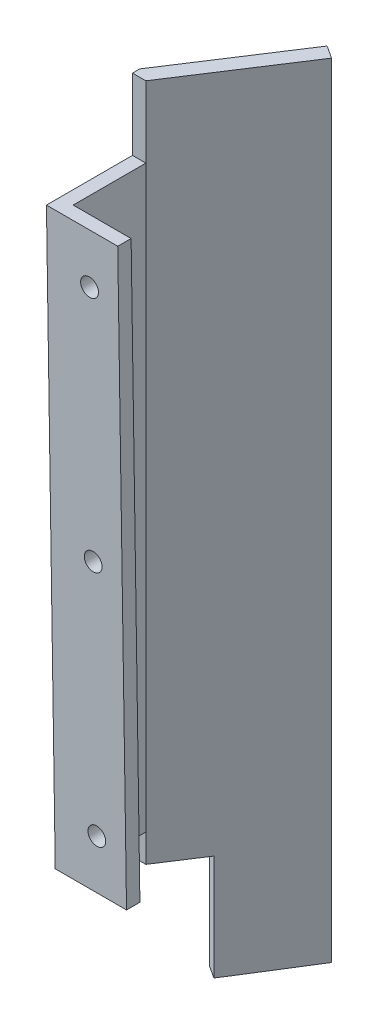
ISO-10303-21;
HEADER;
FILE_DESCRIPTION(('STEP AP214'),'2;1');
FILE_NAME('part.step','',(''),(''),'','','');
FILE_SCHEMA(('AUTOMOTIVE_DESIGN { 1 0 10303 214 1 1 1 1 }'));
ENDSEC;
DATA;
#1=APPLICATION_CONTEXT('core data for automotive mechanical design processes');
#2=APPLICATION_PROTOCOL_DEFINITION('international standard','automotive_design',2000,#1);
#3=PRODUCT_CONTEXT('',#1,'mechanical');
#4=PRODUCT('Part','Part','',(#3));
#5=PRODUCT_RELATED_PRODUCT_CATEGORY('part','',(#4));
#6=PRODUCT_DEFINITION_FORMATION('','',#4);
#7=PRODUCT_DEFINITION_CONTEXT('part definition',#1,'design');
#8=PRODUCT_DEFINITION('design','',#6,#7);
#9=PRODUCT_DEFINITION_SHAPE('','',#8);
#10=(LENGTH_UNIT() NAMED_UNIT(*) SI_UNIT(.MILLI.,.METRE.));
#11=(NAMED_UNIT(*) PLANE_ANGLE_UNIT() SI_UNIT($,.RADIAN.));
#12=(NAMED_UNIT(*) SI_UNIT($,.STERADIAN.) SOLID_ANGLE_UNIT());
#13=UNCERTAINTY_MEASURE_WITH_UNIT(LENGTH_MEASURE(1.E-05),#10,'distance_accuracy_value','');
#14=(GEOMETRIC_REPRESENTATION_CONTEXT(3) GLOBAL_UNCERTAINTY_ASSIGNED_CONTEXT((#13)) GLOBAL_UNIT_ASSIGNED_CONTEXT((#10,
#11,#12)) REPRESENTATION_CONTEXT('',''));
#15=CARTESIAN_POINT('',(0.,0.,0.));
#16=DIRECTION('',(0.,0.,1.));
#17=DIRECTION('',(1.,0.,0.));
#18=AXIS2_PLACEMENT_3D('',#15,#16,#17);
#19=CARTESIAN_POINT('',(0.,0.,0.));
#20=DIRECTION('',(0.,-0.0151837810020936,0.999884719752473));
#21=DIRECTION('',(0.,-0.999884719752473,-0.0151837810020936));
#22=AXIS2_PLACEMENT_3D('',#19,#20,#21);
#23=PLANE('',#22);
#24=CARTESIAN_POINT('',(9.5,41.1951621848328,0.625570436875037));
#25=DIRECTION('',(0.,-0.0151837810020936,0.999884719752473));
#26=DIRECTION('',(0.,-0.999884719752473,-0.0151837810020936));
#27=AXIS2_PLACEMENT_3D('',#24,#25,#26);
#28=CIRCLE('',#27,2.);
#29=CARTESIAN_POINT('',(9.5,39.1953927453278,0.59520287487085));
#30=VERTEX_POINT('',#29);
#31=EDGE_CURVE('E342',#30,#30,#28,.F.);
#32=ORIENTED_EDGE('',*,*,#31,.T.);
#33=EDGE_LOOP('',(#32));
#34=FACE_BOUND('',#33,.T.);
#35=DIRECTION('',(0.,0.999884719752472,0.0151837810020936));
#36=VECTOR('',#35,1.);
#37=CARTESIAN_POINT('',(16.,190.,2.88525100284757));
#38=LINE('',#37,#36);
#39=CARTESIAN_POINT('',(16.,30.,0.455565947818039));
#40=VERTEX_POINT('',#39);
#41=CARTESIAN_POINT('',(16.,160.,2.42968505502953));
#42=VERTEX_POINT('',#41);
#43=EDGE_CURVE('E276',#40,#42,#38,.T.);
#44=ORIENTED_EDGE('',*,*,#43,.T.);
#45=DIRECTION('',(-1.,0.,0.));
#46=VECTOR('',#45,1.);
#47=CARTESIAN_POINT('',(0.,160.,2.42968505502953));
#48=LINE('',#47,#46);
#49=CARTESIAN_POINT('',(0.,160.,2.42968505502953));
#50=VERTEX_POINT('',#49);
#51=EDGE_CURVE('E265',#42,#50,#48,.T.);
#52=ORIENTED_EDGE('',*,*,#51,.T.);
#53=DIRECTION('',(0.,-0.999884719752472,-0.0151837810020936));
#54=VECTOR('',#53,1.);
#55=CARTESIAN_POINT('',(0.,0.,0.));
#56=LINE('',#55,#54);
#57=CARTESIAN_POINT('',(0.,30.,0.455565947818037));
#58=VERTEX_POINT('',#57);
#59=EDGE_CURVE('E176',#50,#58,#56,.T.);
#60=ORIENTED_EDGE('',*,*,#59,.T.);
#61=DIRECTION('',(-1.,0.,0.));
#62=VECTOR('',#61,1.);
#63=CARTESIAN_POINT('',(0.,30.,0.455565947818037));
#64=LINE('',#63,#62);
#65=EDGE_CURVE('E254',#40,#58,#64,.T.);
#66=ORIENTED_EDGE('',*,*,#65,.F.);
#67=EDGE_LOOP('',(#44,#52,#60,#66));
#68=FACE_BOUND('',#67,.T.);
#69=CARTESIAN_POINT('',(9.50000000000001,94.9544486569937,1.44193378006542));
#70=DIRECTION('',(0.,-0.0151837810020936,0.999884719752473));
#71=DIRECTION('',(0.,-0.999884719752473,-0.0151837810020936));
#72=AXIS2_PLACEMENT_3D('',#69,#70,#71);
#73=CIRCLE('',#72,2.);
#74=CARTESIAN_POINT('',(9.50000000000001,92.9546792174888,1.41156621806123));
#75=VERTEX_POINT('',#74);
#76=EDGE_CURVE('E353',#75,#75,#73,.T.);
#77=ORIENTED_EDGE('',*,*,#76,.F.);
#78=EDGE_LOOP('',(#77));
#79=FACE_BOUND('',#78,.T.);
#80=CARTESIAN_POINT('',(9.5,148.713735129155,2.2582971232558));
#81=DIRECTION('',(0.,-0.0151837810020936,0.999884719752473));
#82=DIRECTION('',(0.,-0.999884719752473,-0.0151837810020936));
#83=AXIS2_PLACEMENT_3D('',#80,#81,#82);
#84=CIRCLE('',#83,2.);
#85=CARTESIAN_POINT('',(9.5,146.71396568965,2.22792956125161));
#86=VERTEX_POINT('',#85);
#87=EDGE_CURVE('E357',#86,#86,#84,.T.);
#88=ORIENTED_EDGE('',*,*,#87,.F.);
#89=EDGE_LOOP('',(#88));
#90=FACE_BOUND('',#89,.T.);
#91=ADVANCED_FACE('F43',(#34,#68,#79,#90),#23,.T.);
#92=CARTESIAN_POINT('',(0.,0.0455513430062808,-2.99965415925742));
#93=DIRECTION('',(0.,-0.0151837810020936,0.999884719752473));
#94=DIRECTION('',(0.,-0.999884719752473,-0.0151837810020936));
#95=AXIS2_PLACEMENT_3D('',#92,#93,#94);
#96=PLANE('',#95);
#97=CARTESIAN_POINT('',(9.50000000000001,95.,-1.557720379192));
#98=DIRECTION('',(0.,0.0151837810020936,-0.999884719752473));
#99=DIRECTION('',(0.,0.999884719752473,0.0151837810020936));
#100=AXIS2_PLACEMENT_3D('',#97,#98,#99);
#101=CIRCLE('',#100,2.);
#102=CARTESIAN_POINT('',(9.50000000000001,96.999769439505,-1.52735281718782));
#103=VERTEX_POINT('',#102);
#104=EDGE_CURVE('E343',#103,#103,#101,.T.);
#105=ORIENTED_EDGE('',*,*,#104,.F.);
#106=EDGE_LOOP('',(#105));
#107=FACE_BOUND('',#106,.T.);
#108=CARTESIAN_POINT('',(9.5,41.240713527839,-2.37408372238238));
#109=DIRECTION('',(0.,-0.0151837810020936,0.999884719752473));
#110=DIRECTION('',(0.,-0.999884719752473,-0.0151837810020936));
#111=AXIS2_PLACEMENT_3D('',#108,#109,#110);
#112=CIRCLE('',#111,2.);
#113=CARTESIAN_POINT('',(9.5,39.2409440883341,-2.40445128438657));
#114=VERTEX_POINT('',#113);
#115=EDGE_CURVE('E334',#114,#114,#112,.T.);
#116=ORIENTED_EDGE('',*,*,#115,.T.);
#117=EDGE_LOOP('',(#116));
#118=FACE_BOUND('',#117,.T.);
#119=DIRECTION('',(-1.,0.,0.));
#120=VECTOR('',#119,1.);
#121=CARTESIAN_POINT('',(0.,160.,-0.570660825586255));
#122=LINE('',#121,#120);
#123=CARTESIAN_POINT('',(16.,160.,-0.570660825586253));
#124=VERTEX_POINT('',#123);
#125=CARTESIAN_POINT('',(3.,160.,-0.570660825586254));
#126=VERTEX_POINT('',#125);
#127=EDGE_CURVE('E190',#124,#126,#122,.T.);
#128=ORIENTED_EDGE('',*,*,#127,.F.);
#129=DIRECTION('',(0.,0.999884719752472,0.0151837810020936));
#130=VECTOR('',#129,1.);
#131=CARTESIAN_POINT('',(16.,190.045551343006,-0.114403156409848));
#132=LINE('',#131,#130);
#133=CARTESIAN_POINT('',(16.,30.,-2.54477993279775));
#134=VERTEX_POINT('',#133);
#135=EDGE_CURVE('E281',#134,#124,#132,.T.);
#136=ORIENTED_EDGE('',*,*,#135,.F.);
#137=DIRECTION('',(-1.,0.,0.));
#138=VECTOR('',#137,1.);
#139=CARTESIAN_POINT('',(0.,30.,-2.54477993279775));
#140=LINE('',#139,#138);
#141=CARTESIAN_POINT('',(3.,30.,-2.54477993279775));
#142=VERTEX_POINT('',#141);
#143=EDGE_CURVE('E186',#134,#142,#140,.T.);
#144=ORIENTED_EDGE('',*,*,#143,.T.);
#145=DIRECTION('',(0.,-0.999884719752472,-0.0151837810020936));
#146=VECTOR('',#145,1.);
#147=CARTESIAN_POINT('',(3.,190.045551343006,-0.114403156409849));
#148=LINE('',#147,#146);
#149=EDGE_CURVE('E277',#126,#142,#148,.T.);
#150=ORIENTED_EDGE('',*,*,#149,.F.);
#151=EDGE_LOOP('',(#128,#136,#144,#150));
#152=FACE_BOUND('',#151,.T.);
#153=CARTESIAN_POINT('',(9.5,148.759286472161,-0.741357036001623));
#154=DIRECTION('',(0.,0.0151837810020936,-0.999884719752473));
#155=DIRECTION('',(0.,0.999884719752473,0.0151837810020936));
#156=AXIS2_PLACEMENT_3D('',#153,#154,#155);
#157=CIRCLE('',#156,2.);
#158=CARTESIAN_POINT('',(9.5,150.759055911666,-0.710989473997435));
#159=VERTEX_POINT('',#158);
#160=EDGE_CURVE('E338',#159,#159,#157,.T.);
#161=ORIENTED_EDGE('',*,*,#160,.F.);
#162=EDGE_LOOP('',(#161));
#163=FACE_BOUND('',#162,.T.);
#164=ADVANCED_FACE('F304',(#107,#118,#152,#163),#96,.F.);
#165=CARTESIAN_POINT('',(3.,190.,0.));
#166=DIRECTION('',(-1.,0.,0.));
#167=DIRECTION('',(0.,0.,1.));
#168=AXIS2_PLACEMENT_3D('',#165,#166,#167);
#169=PLANE('',#168);
#170=DIRECTION('',(0.,0.,-1.));
#171=VECTOR('',#170,1.);
#172=CARTESIAN_POINT('',(3.,160.,0.));
#173=LINE('',#172,#171);
#174=CARTESIAN_POINT('',(3.00000000000001,160.,-16.8765178619251));
#175=VERTEX_POINT('',#174);
#176=EDGE_CURVE('E269',#126,#175,#173,.T.);
#177=ORIENTED_EDGE('',*,*,#176,.F.);
#178=ORIENTED_EDGE('',*,*,#149,.T.);
#179=DIRECTION('',(0.,0.,-1.));
#180=VECTOR('',#179,1.);
#181=CARTESIAN_POINT('',(3.,30.,0.));
#182=LINE('',#181,#180);
#183=CARTESIAN_POINT('',(3.,30.,-16.8765178619251));
#184=VERTEX_POINT('',#183);
#185=EDGE_CURVE('E257',#142,#184,#182,.T.);
#186=ORIENTED_EDGE('',*,*,#185,.T.);
#187=DIRECTION('',(0.,-1.,0.));
#188=VECTOR('',#187,1.);
#189=CARTESIAN_POINT('',(3.,190.,-16.8765178619251));
#190=LINE('',#189,#188);
#191=EDGE_CURVE('E182',#175,#184,#190,.T.);
#192=ORIENTED_EDGE('',*,*,#191,.F.);
#193=EDGE_LOOP('',(#177,#178,#186,#192));
#194=FACE_BOUND('',#193,.T.);
#195=ADVANCED_FACE('F45',(#194),#169,.F.);
#196=CARTESIAN_POINT('',(0.,0.,0.));
#197=DIRECTION('',(0.,1.,0.));
#198=DIRECTION('',(0.,0.,1.));
#199=AXIS2_PLACEMENT_3D('',#196,#197,#198);
#200=PLANE('',#199);
#201=DIRECTION('',(-0.83822570686827,0.,-0.545323449289675));
#202=VECTOR('',#201,1.);
#203=CARTESIAN_POINT('',(29.3858124077585,0.,-12.8769403632549));
#204=LINE('',#203,#202);
#205=CARTESIAN_POINT('',(9.01832785776317,0.,-26.1273893021862));
#206=VERTEX_POINT('',#205);
#207=CARTESIAN_POINT('',(6.16836045441106,0.,-27.9814890297711));
#208=VERTEX_POINT('',#207);
#209=EDGE_CURVE('E206',#206,#208,#204,.T.);
#210=ORIENTED_EDGE('',*,*,#209,.T.);
#211=DIRECTION('',(1.,0.,0.));
#212=VECTOR('',#211,1.);
#213=CARTESIAN_POINT('',(0.,0.,-27.9814890297711));
#214=LINE('',#213,#212);
#215=CARTESIAN_POINT('',(10.2245471976015,0.,-27.981489029772));
#216=VERTEX_POINT('',#215);
#217=EDGE_CURVE('E215',#208,#216,#214,.T.);
#218=ORIENTED_EDGE('',*,*,#217,.T.);
#219=DIRECTION('',(0.545323449289675,0.,-0.83822570686827));
#220=VECTOR('',#219,1.);
#221=CARTESIAN_POINT('',(19.4278002617582,0.,-42.1279617612105));
#222=LINE('',#221,#220);
#223=EDGE_CURVE('E169',#206,#216,#222,.T.);
#224=ORIENTED_EDGE('',*,*,#223,.F.);
#225=EDGE_LOOP('',(#210,#218,#224));
#226=FACE_BOUND('',#225,.T.);
#227=ADVANCED_FACE('F214',(#226),#200,.F.);
#228=CARTESIAN_POINT('',(16.,190.045551343006,-0.114403156409848));
#229=DIRECTION('',(1.,0.,0.));
#230=DIRECTION('',(0.,1.,0.));
#231=AXIS2_PLACEMENT_3D('',#228,#229,#230);
#232=PLANE('',#231);
#233=ORIENTED_EDGE('',*,*,#135,.T.);
#234=DIRECTION('',(0.,0.,1.));
#235=VECTOR('',#234,1.);
#236=CARTESIAN_POINT('',(16.,160.,-0.114403156409848));
#237=LINE('',#236,#235);
#238=EDGE_CURVE('E261',#124,#42,#237,.T.);
#239=ORIENTED_EDGE('',*,*,#238,.T.);
#240=ORIENTED_EDGE('',*,*,#43,.F.);
#241=DIRECTION('',(0.,0.,1.));
#242=VECTOR('',#241,1.);
#243=CARTESIAN_POINT('',(16.,30.,-0.114403156409848));
#244=LINE('',#243,#242);
#245=EDGE_CURVE('E241',#134,#40,#244,.T.);
#246=ORIENTED_EDGE('',*,*,#245,.F.);
#247=EDGE_LOOP('',(#233,#239,#240,#246));
#248=FACE_BOUND('',#247,.T.);
#249=ADVANCED_FACE('F301',(#248),#232,.T.);
#250=CARTESIAN_POINT('',(19.4278002617582,190.,-42.1279617612105));
#251=DIRECTION('',(-0.838225706868271,0.,-0.545323449289675));
#252=DIRECTION('',(-0.545323449289675,0.,0.838225706868271));
#253=AXIS2_PLACEMENT_3D('',#250,#251,#252);
#254=PLANE('',#253);
#255=DIRECTION('',(0.,-1.,0.));
#256=VECTOR('',#255,1.);
#257=CARTESIAN_POINT('',(19.4278002617582,190.,-42.1279617612105));
#258=LINE('',#257,#256);
#259=CARTESIAN_POINT('',(19.4278002617582,176.,-42.1279617612105));
#260=VERTEX_POINT('',#259);
#261=CARTESIAN_POINT('',(19.4278002617582,0.214821708605994,-42.1279617612105));
#262=VERTEX_POINT('',#261);
#263=EDGE_CURVE('E173',#260,#262,#258,.T.);
#264=ORIENTED_EDGE('',*,*,#263,.F.);
#265=DIRECTION('',(-0.545323449289675,0.,0.838225706868271));
#266=VECTOR('',#265,1.);
#267=CARTESIAN_POINT('',(19.4278002617582,176.,-42.1279617612105));
#268=LINE('',#267,#266);
#269=CARTESIAN_POINT('',(3.00000000000001,176.,-16.8765178619251));
#270=VERTEX_POINT('',#269);
#271=EDGE_CURVE('E160',#260,#270,#268,.T.);
#272=ORIENTED_EDGE('',*,*,#271,.T.);
#273=EDGE_CURVE('E183',#270,#175,#190,.T.);
#274=ORIENTED_EDGE('',*,*,#273,.T.);
#275=ORIENTED_EDGE('',*,*,#191,.T.);
#276=DIRECTION('',(0.,1.,0.));
#277=VECTOR('',#276,1.);
#278=CARTESIAN_POINT('',(3.,190.,-16.8765178619251));
#279=LINE('',#278,#277);
#280=CARTESIAN_POINT('',(3.,23.695751879168,-16.8765178619251));
#281=VERTEX_POINT('',#280);
#282=EDGE_CURVE('E273',#281,#184,#279,.T.);
#283=ORIENTED_EDGE('',*,*,#282,.F.);
#284=DIRECTION('',(0.545323449289675,0.,-0.838225706868271));
#285=VECTOR('',#284,1.);
#286=CARTESIAN_POINT('',(19.4278002617582,23.6957518791679,-42.1279617612105));
#287=LINE('',#286,#285);
#288=CARTESIAN_POINT('',(9.01832785776318,23.695751879168,-26.1273893021862));
#289=VERTEX_POINT('',#288);
#290=EDGE_CURVE('E66',#281,#289,#287,.T.);
#291=ORIENTED_EDGE('',*,*,#290,.T.);
#292=DIRECTION('',(0.,-1.,0.));
#293=VECTOR('',#292,1.);
#294=CARTESIAN_POINT('',(9.01832785776317,190.,-26.1273893021862));
#295=LINE('',#294,#293);
#296=EDGE_CURVE('E227',#289,#206,#295,.T.);
#297=ORIENTED_EDGE('',*,*,#296,.T.);
#298=ORIENTED_EDGE('',*,*,#223,.T.);
#299=DIRECTION('',(0.545279276649534,0.0127278718797271,-0.838157808371416));
#300=VECTOR('',#299,1.);
#301=CARTESIAN_POINT('',(20.7449558531726,0.245566665055097,-44.1525834386883));
#302=LINE('',#301,#300);
#303=EDGE_CURVE('E329',#216,#262,#302,.T.);
#304=ORIENTED_EDGE('',*,*,#303,.T.);
#305=EDGE_LOOP('',(#264,#272,#274,#275,#283,#291,#297,#298,#304));
#306=FACE_BOUND('',#305,.T.);
#307=ADVANCED_FACE('F317',(#306),#254,.F.);
#308=CARTESIAN_POINT('',(16.5778328584061,190.,-43.9820614887954));
#309=DIRECTION('',(-0.545323449289676,0.,0.83822570686827));
#310=DIRECTION('',(0.83822570686827,0.,0.545323449289676));
#311=AXIS2_PLACEMENT_3D('',#308,#309,#310);
#312=PLANE('',#311);
#313=DIRECTION('',(0.,-1.,0.));
#314=VECTOR('',#313,1.);
#315=CARTESIAN_POINT('',(16.5778328584061,190.,-43.9820614887954));
#316=LINE('',#315,#314);
#317=CARTESIAN_POINT('',(16.5778328584061,176.,-43.9820614887954));
#318=VERTEX_POINT('',#317);
#319=CARTESIAN_POINT('',(16.5778328584061,0.242977198597552,-43.9820614887954));
#320=VERTEX_POINT('',#319);
#321=EDGE_CURVE('E168',#318,#320,#316,.T.);
#322=ORIENTED_EDGE('',*,*,#321,.F.);
#323=DIRECTION('',(0.83822570686827,0.,0.545323449289676));
#324=VECTOR('',#323,1.);
#325=CARTESIAN_POINT('',(16.5778328584061,176.,-43.9820614887954));
#326=LINE('',#325,#324);
#327=EDGE_CURVE('E143',#318,#260,#326,.T.);
#328=ORIENTED_EDGE('',*,*,#327,.T.);
#329=ORIENTED_EDGE('',*,*,#263,.T.);
#330=DIRECTION('',(-0.838196967515067,0.00828074254535564,-0.545304752364623));
#331=VECTOR('',#330,1.);
#332=CARTESIAN_POINT('',(15.2607496120584,0.25598896993112,-44.838914688375));
#333=LINE('',#332,#331);
#334=EDGE_CURVE('E148',#262,#320,#333,.T.);
#335=ORIENTED_EDGE('',*,*,#334,.T.);
#336=EDGE_LOOP('',(#322,#328,#329,#335));
#337=FACE_BOUND('',#336,.T.);
#338=ADVANCED_FACE('F325',(#337),#312,.F.);
#339=CARTESIAN_POINT('',(0.,190.,-18.5));
#340=DIRECTION('',(0.83822570686827,0.,0.545323449289675));
#341=DIRECTION('',(0.545323449289675,0.,-0.83822570686827));
#342=AXIS2_PLACEMENT_3D('',#339,#340,#341);
#343=PLANE('',#342);
#344=DIRECTION('',(0.,-1.,0.));
#345=VECTOR('',#344,1.);
#346=CARTESIAN_POINT('',(0.,190.,-18.5));
#347=LINE('',#346,#345);
#348=CARTESIAN_POINT('',(0.,176.,-18.5));
#349=VERTEX_POINT('',#348);
#350=CARTESIAN_POINT('',(0.,23.695751879168,-18.5));
#351=VERTEX_POINT('',#350);
#352=EDGE_CURVE('E154',#349,#351,#347,.T.);
#353=ORIENTED_EDGE('',*,*,#352,.F.);
#354=DIRECTION('',(0.545323449289675,0.,-0.83822570686827));
#355=VECTOR('',#354,1.);
#356=CARTESIAN_POINT('',(0.,176.,-18.5));
#357=LINE('',#356,#355);
#358=EDGE_CURVE('E140',#349,#318,#357,.T.);
#359=ORIENTED_EDGE('',*,*,#358,.T.);
#360=ORIENTED_EDGE('',*,*,#321,.T.);
#361=DIRECTION('',(-0.545279276649534,-0.0127278718797271,0.838157808371416));
#362=VECTOR('',#361,1.);
#363=CARTESIAN_POINT('',(1.31964577316852,-0.113178369116479,-20.5284493771004));
#364=LINE('',#363,#362);
#365=EDGE_CURVE('E52',#320,#208,#364,.T.);
#366=ORIENTED_EDGE('',*,*,#365,.T.);
#367=DIRECTION('',(0.,-1.,0.));
#368=VECTOR('',#367,1.);
#369=CARTESIAN_POINT('',(6.16836045441106,0.,-27.9814890297711));
#370=LINE('',#369,#368);
#371=CARTESIAN_POINT('',(6.16836045441106,23.695751879168,-27.9814890297711));
#372=VERTEX_POINT('',#371);
#373=EDGE_CURVE('E199',#372,#208,#370,.T.);
#374=ORIENTED_EDGE('',*,*,#373,.F.);
#375=DIRECTION('',(0.545323449289675,0.,-0.83822570686827));
#376=VECTOR('',#375,1.);
#377=CARTESIAN_POINT('',(-0.742100396387685,23.695751879168,-17.3593051882519));
#378=LINE('',#377,#376);
#379=EDGE_CURVE('E166',#351,#372,#378,.T.);
#380=ORIENTED_EDGE('',*,*,#379,.F.);
#381=EDGE_LOOP('',(#353,#359,#360,#366,#374,#380));
#382=FACE_BOUND('',#381,.T.);
#383=ADVANCED_FACE('F163',(#382),#343,.F.);
#384=CARTESIAN_POINT('',(0.,190.,0.));
#385=DIRECTION('',(1.,0.,0.));
#386=DIRECTION('',(0.,0.,-1.));
#387=AXIS2_PLACEMENT_3D('',#384,#385,#386);
#388=PLANE('',#387);
#389=DIRECTION('',(0.,1.,0.));
#390=VECTOR('',#389,1.);
#391=CARTESIAN_POINT('',(0.,160.,-16.8765178619251));
#392=LINE('',#391,#390);
#393=CARTESIAN_POINT('',(0.,160.,-16.8765178619251));
#394=VERTEX_POINT('',#393);
#395=CARTESIAN_POINT('',(0.,176.,-16.8765178619251));
#396=VERTEX_POINT('',#395);
#397=EDGE_CURVE('E158',#394,#396,#392,.T.);
#398=ORIENTED_EDGE('',*,*,#397,.T.);
#399=DIRECTION('',(0.,0.,1.));
#400=VECTOR('',#399,1.);
#401=CARTESIAN_POINT('',(0.,176.,-46.7571517547897));
#402=LINE('',#401,#400);
#403=EDGE_CURVE('E59',#349,#396,#402,.T.);
#404=ORIENTED_EDGE('',*,*,#403,.F.);
#405=ORIENTED_EDGE('',*,*,#352,.T.);
#406=DIRECTION('',(0.,0.,1.));
#407=VECTOR('',#406,1.);
#408=CARTESIAN_POINT('',(0.,23.695751879168,0.));
#409=LINE('',#408,#407);
#410=CARTESIAN_POINT('',(0.,23.695751879168,-16.8765178619251));
#411=VERTEX_POINT('',#410);
#412=EDGE_CURVE('E217',#351,#411,#409,.T.);
#413=ORIENTED_EDGE('',*,*,#412,.T.);
#414=DIRECTION('',(0.,-1.,0.));
#415=VECTOR('',#414,1.);
#416=CARTESIAN_POINT('',(0.,30.,-16.8765178619251));
#417=LINE('',#416,#415);
#418=CARTESIAN_POINT('',(0.,30.,-16.8765178619251));
#419=VERTEX_POINT('',#418);
#420=EDGE_CURVE('E245',#419,#411,#417,.T.);
#421=ORIENTED_EDGE('',*,*,#420,.F.);
#422=DIRECTION('',(0.,0.,1.));
#423=VECTOR('',#422,1.);
#424=CARTESIAN_POINT('',(0.,30.,-16.8765178619251));
#425=LINE('',#424,#423);
#426=EDGE_CURVE('E234',#419,#58,#425,.T.);
#427=ORIENTED_EDGE('',*,*,#426,.T.);
#428=ORIENTED_EDGE('',*,*,#59,.F.);
#429=DIRECTION('',(0.,0.,1.));
#430=VECTOR('',#429,1.);
#431=CARTESIAN_POINT('',(0.,160.,-16.8765178619251));
#432=LINE('',#431,#430);
#433=EDGE_CURVE('E233',#394,#50,#432,.T.);
#434=ORIENTED_EDGE('',*,*,#433,.F.);
#435=EDGE_LOOP('',(#398,#404,#405,#413,#421,#427,#428,#434));
#436=FACE_BOUND('',#435,.T.);
#437=ADVANCED_FACE('F152',(#436),#388,.F.);
#438=CARTESIAN_POINT('',(0.,30.,-16.8765178619251));
#439=DIRECTION('',(0.,0.,1.));
#440=DIRECTION('',(1.,0.,0.));
#441=AXIS2_PLACEMENT_3D('',#438,#439,#440);
#442=PLANE('',#441);
#443=DIRECTION('',(-1.,0.,0.));
#444=VECTOR('',#443,1.);
#445=CARTESIAN_POINT('',(0.,23.695751879168,-16.8765178619251));
#446=LINE('',#445,#444);
#447=EDGE_CURVE('E193',#281,#411,#446,.T.);
#448=ORIENTED_EDGE('',*,*,#447,.F.);
#449=ORIENTED_EDGE('',*,*,#282,.T.);
#450=DIRECTION('',(1.,0.,0.));
#451=VECTOR('',#450,1.);
#452=CARTESIAN_POINT('',(0.,30.,-16.8765178619251));
#453=LINE('',#452,#451);
#454=EDGE_CURVE('E230',#419,#184,#453,.T.);
#455=ORIENTED_EDGE('',*,*,#454,.F.);
#456=ORIENTED_EDGE('',*,*,#420,.T.);
#457=EDGE_LOOP('',(#448,#449,#455,#456));
#458=FACE_BOUND('',#457,.T.);
#459=ADVANCED_FACE('F363',(#458),#442,.T.);
#460=CARTESIAN_POINT('',(0.,30.,-16.8765178619251));
#461=DIRECTION('',(0.,1.,0.));
#462=DIRECTION('',(0.,0.,1.));
#463=AXIS2_PLACEMENT_3D('',#460,#461,#462);
#464=PLANE('',#463);
#465=ORIENTED_EDGE('',*,*,#143,.F.);
#466=ORIENTED_EDGE('',*,*,#245,.T.);
#467=ORIENTED_EDGE('',*,*,#65,.T.);
#468=ORIENTED_EDGE('',*,*,#426,.F.);
#469=ORIENTED_EDGE('',*,*,#454,.T.);
#470=ORIENTED_EDGE('',*,*,#185,.F.);
#471=EDGE_LOOP('',(#465,#466,#467,#468,#469,#470));
#472=FACE_BOUND('',#471,.T.);
#473=ADVANCED_FACE('F297',(#472),#464,.F.);
#474=CARTESIAN_POINT('',(0.,160.,-16.8765178619251));
#475=DIRECTION('',(0.,0.,-1.));
#476=DIRECTION('',(-1.,0.,0.));
#477=AXIS2_PLACEMENT_3D('',#474,#475,#476);
#478=PLANE('',#477);
#479=ORIENTED_EDGE('',*,*,#273,.F.);
#480=DIRECTION('',(-1.,0.,0.));
#481=VECTOR('',#480,1.);
#482=CARTESIAN_POINT('',(0.,176.,-16.8765178619251));
#483=LINE('',#482,#481);
#484=EDGE_CURVE('E11',#270,#396,#483,.T.);
#485=ORIENTED_EDGE('',*,*,#484,.T.);
#486=ORIENTED_EDGE('',*,*,#397,.F.);
#487=DIRECTION('',(1.,0.,0.));
#488=VECTOR('',#487,1.);
#489=CARTESIAN_POINT('',(0.,160.,-16.8765178619251));
#490=LINE('',#489,#488);
#491=EDGE_CURVE('E237',#394,#175,#490,.T.);
#492=ORIENTED_EDGE('',*,*,#491,.T.);
#493=EDGE_LOOP('',(#479,#485,#486,#492));
#494=FACE_BOUND('',#493,.T.);
#495=ADVANCED_FACE('F321',(#494),#478,.F.);
#496=CARTESIAN_POINT('',(0.,160.,-16.8765178619251));
#497=DIRECTION('',(0.,1.,0.));
#498=DIRECTION('',(0.,0.,1.));
#499=AXIS2_PLACEMENT_3D('',#496,#497,#498);
#500=PLANE('',#499);
#501=ORIENTED_EDGE('',*,*,#176,.T.);
#502=ORIENTED_EDGE('',*,*,#491,.F.);
#503=ORIENTED_EDGE('',*,*,#433,.T.);
#504=ORIENTED_EDGE('',*,*,#51,.F.);
#505=ORIENTED_EDGE('',*,*,#238,.F.);
#506=ORIENTED_EDGE('',*,*,#127,.T.);
#507=EDGE_LOOP('',(#501,#502,#503,#504,#505,#506));
#508=FACE_BOUND('',#507,.T.);
#509=ADVANCED_FACE('F309',(#508),#500,.T.);
#510=CARTESIAN_POINT('',(29.3858124077585,0.,-12.8769403632549));
#511=DIRECTION('',(0.545323449289675,0.,-0.83822570686827));
#512=DIRECTION('',(-0.83822570686827,0.,-0.545323449289675));
#513=AXIS2_PLACEMENT_3D('',#510,#511,#512);
#514=PLANE('',#513);
#515=DIRECTION('',(-0.83822570686827,0.,-0.545323449289675));
#516=VECTOR('',#515,1.);
#517=CARTESIAN_POINT('',(29.3858124077585,23.695751879168,-12.8769403632549));
#518=LINE('',#517,#516);
#519=EDGE_CURVE('E208',#289,#372,#518,.T.);
#520=ORIENTED_EDGE('',*,*,#519,.T.);
#521=ORIENTED_EDGE('',*,*,#373,.T.);
#522=ORIENTED_EDGE('',*,*,#209,.F.);
#523=ORIENTED_EDGE('',*,*,#296,.F.);
#524=EDGE_LOOP('',(#520,#521,#522,#523));
#525=FACE_BOUND('',#524,.T.);
#526=ADVANCED_FACE('F205',(#525),#514,.F.);
#527=CARTESIAN_POINT('',(22.4753515569598,23.695751879168,-2.25475652173574));
#528=DIRECTION('',(0.,1.,0.));
#529=DIRECTION('',(0.,0.,1.));
#530=AXIS2_PLACEMENT_3D('',#527,#528,#529);
#531=PLANE('',#530);
#532=ORIENTED_EDGE('',*,*,#447,.T.);
#533=ORIENTED_EDGE('',*,*,#412,.F.);
#534=ORIENTED_EDGE('',*,*,#379,.T.);
#535=ORIENTED_EDGE('',*,*,#519,.F.);
#536=ORIENTED_EDGE('',*,*,#290,.F.);
#537=EDGE_LOOP('',(#532,#533,#534,#535,#536));
#538=FACE_BOUND('',#537,.T.);
#539=ADVANCED_FACE('F361',(#538),#531,.F.);
#540=CARTESIAN_POINT('',(9.5,41.1582746319496,3.05469533480484));
#541=DIRECTION('',(0.,0.0151837810020936,-0.999884719752473));
#542=DIRECTION('',(0.,0.999884719752473,0.0151837810020936));
#543=AXIS2_PLACEMENT_3D('',#540,#541,#542);
#544=CYLINDRICAL_SURFACE('',#543,2.);
#545=ORIENTED_EDGE('',*,*,#31,.F.);
#546=EDGE_LOOP('',(#545));
#547=FACE_BOUND('',#546,.T.);
#548=ORIENTED_EDGE('',*,*,#115,.F.);
#549=EDGE_LOOP('',(#548));
#550=FACE_BOUND('',#549,.T.);
#551=ADVANCED_FACE('F418',(#547,#550),#544,.F.);
#552=CARTESIAN_POINT('',(9.50000000000001,94.9175611041106,3.87105867799522));
#553=DIRECTION('',(0.,0.0151837810020936,-0.999884719752473));
#554=DIRECTION('',(0.,0.999884719752473,0.0151837810020936));
#555=AXIS2_PLACEMENT_3D('',#552,#553,#554);
#556=CYLINDRICAL_SURFACE('',#555,2.);
#557=ORIENTED_EDGE('',*,*,#76,.T.);
#558=EDGE_LOOP('',(#557));
#559=FACE_BOUND('',#558,.T.);
#560=ORIENTED_EDGE('',*,*,#104,.T.);
#561=EDGE_LOOP('',(#560));
#562=FACE_BOUND('',#561,.T.);
#563=ADVANCED_FACE('F423',(#559,#562),#556,.F.);
#564=CARTESIAN_POINT('',(9.5,148.676847576272,4.6874220211856));
#565=DIRECTION('',(0.,0.0151837810020936,-0.999884719752473));
#566=DIRECTION('',(0.,0.999884719752473,0.0151837810020936));
#567=AXIS2_PLACEMENT_3D('',#564,#565,#566);
#568=CYLINDRICAL_SURFACE('',#567,2.);
#569=ORIENTED_EDGE('',*,*,#87,.T.);
#570=EDGE_LOOP('',(#569));
#571=FACE_BOUND('',#570,.T.);
#572=ORIENTED_EDGE('',*,*,#160,.T.);
#573=EDGE_LOOP('',(#572));
#574=FACE_BOUND('',#573,.T.);
#575=ADVANCED_FACE('F435',(#571,#574),#568,.F.);
#576=CARTESIAN_POINT('',(6.16836045441106,0.286725149932124,-46.8629584178199));
#577=DIRECTION('',(0.,0.999884719752473,0.0151837810020936));
#578=DIRECTION('',(0.,-0.0151837810020936,0.999884719752473));
#579=AXIS2_PLACEMENT_3D('',#576,#577,#578);
#580=PLANE('',#579);
#581=ORIENTED_EDGE('',*,*,#365,.F.);
#582=ORIENTED_EDGE('',*,*,#334,.F.);
#583=ORIENTED_EDGE('',*,*,#303,.F.);
#584=ORIENTED_EDGE('',*,*,#217,.F.);
#585=EDGE_LOOP('',(#581,#582,#583,#584));
#586=FACE_BOUND('',#585,.T.);
#587=ADVANCED_FACE('F445',(#586),#580,.F.);
#588=CARTESIAN_POINT('',(81.,176.,-46.7571517547897));
#589=DIRECTION('',(0.,-1.,0.));
#590=DIRECTION('',(0.,0.,-1.));
#591=AXIS2_PLACEMENT_3D('',#588,#589,#590);
#592=PLANE('',#591);
#593=ORIENTED_EDGE('',*,*,#403,.T.);
#594=ORIENTED_EDGE('',*,*,#484,.F.);
#595=ORIENTED_EDGE('',*,*,#271,.F.);
#596=ORIENTED_EDGE('',*,*,#327,.F.);
#597=ORIENTED_EDGE('',*,*,#358,.F.);
#598=EDGE_LOOP('',(#593,#594,#595,#596,#597));
#599=FACE_BOUND('',#598,.T.);
#600=ADVANCED_FACE('F141',(#599),#592,.F.);
#601=CLOSED_SHELL('',(#91,#164,#195,#227,#249,#307,#338,#383,#437,#459,#473,#495,#509,#526,#539,
#551,#563,#575,#587,#600));
#602=MANIFOLD_SOLID_BREP('B2',#601);
#603=ADVANCED_BREP_SHAPE_REPRESENTATION('',(#18,#602),#14);
#604=SHAPE_DEFINITION_REPRESENTATION(#9,#603);
ENDSEC;
END-ISO-10303-21;
